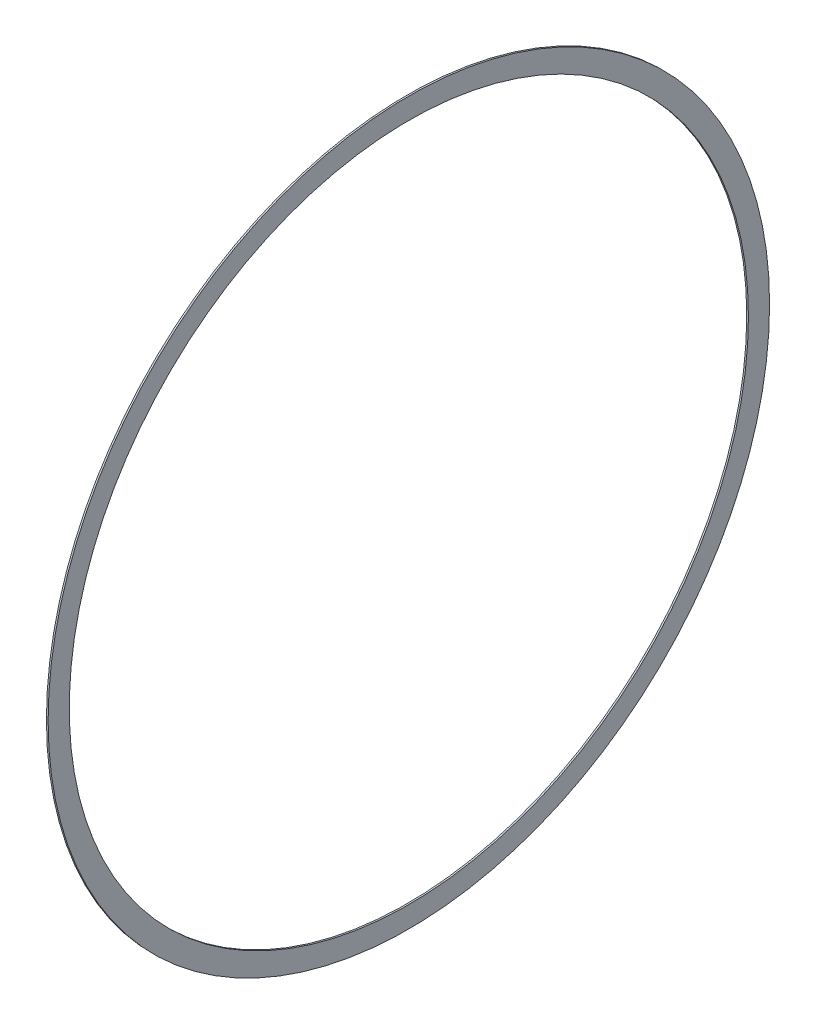
ISO-10303-21;
HEADER;
FILE_DESCRIPTION(('STEP AP214'),'2;1');
FILE_NAME('part.step','',(''),(''),'','','');
FILE_SCHEMA(('AUTOMOTIVE_DESIGN { 1 0 10303 214 1 1 1 1 }'));
ENDSEC;
DATA;
#1=APPLICATION_CONTEXT('core data for automotive mechanical design processes');
#2=APPLICATION_PROTOCOL_DEFINITION('international standard','automotive_design',2000,#1);
#3=PRODUCT_CONTEXT('',#1,'mechanical');
#4=PRODUCT('Part','Part','',(#3));
#5=PRODUCT_RELATED_PRODUCT_CATEGORY('part','',(#4));
#6=PRODUCT_DEFINITION_FORMATION('','',#4);
#7=PRODUCT_DEFINITION_CONTEXT('part definition',#1,'design');
#8=PRODUCT_DEFINITION('design','',#6,#7);
#9=PRODUCT_DEFINITION_SHAPE('','',#8);
#10=(LENGTH_UNIT() NAMED_UNIT(*) SI_UNIT(.MILLI.,.METRE.));
#11=(NAMED_UNIT(*) PLANE_ANGLE_UNIT() SI_UNIT($,.RADIAN.));
#12=(NAMED_UNIT(*) SI_UNIT($,.STERADIAN.) SOLID_ANGLE_UNIT());
#13=UNCERTAINTY_MEASURE_WITH_UNIT(LENGTH_MEASURE(1.E-05),#10,'distance_accuracy_value','');
#14=(GEOMETRIC_REPRESENTATION_CONTEXT(3) GLOBAL_UNCERTAINTY_ASSIGNED_CONTEXT((#13)) GLOBAL_UNIT_ASSIGNED_CONTEXT((#10,
#11,#12)) REPRESENTATION_CONTEXT('',''));
#15=CARTESIAN_POINT('',(0.,0.,0.));
#16=DIRECTION('',(0.,0.,1.));
#17=DIRECTION('',(1.,0.,0.));
#18=AXIS2_PLACEMENT_3D('',#15,#16,#17);
#19=CARTESIAN_POINT('',(4.,0.,0.));
#20=DIRECTION('',(1.,0.,0.));
#21=DIRECTION('',(0.,0.,-1.));
#22=AXIS2_PLACEMENT_3D('',#19,#20,#21);
#23=PLANE('',#22);
#24=CARTESIAN_POINT('',(4.,0.,0.));
#25=DIRECTION('',(1.,0.,0.));
#26=DIRECTION('',(0.,0.,-1.));
#27=AXIS2_PLACEMENT_3D('',#24,#25,#26);
#28=CIRCLE('',#27,853.);
#29=CARTESIAN_POINT('',(4.,0.,-853.));
#30=VERTEX_POINT('',#29);
#31=EDGE_CURVE('E10',#30,#30,#28,.T.);
#32=ORIENTED_EDGE('',*,*,#31,.T.);
#33=EDGE_LOOP('',(#32));
#34=FACE_BOUND('',#33,.T.);
#35=CARTESIAN_POINT('',(4.,0.,0.));
#36=DIRECTION('',(1.,0.,0.));
#37=DIRECTION('',(0.,0.,-1.));
#38=AXIS2_PLACEMENT_3D('',#35,#36,#37);
#39=CIRCLE('',#38,803.);
#40=CARTESIAN_POINT('',(4.,0.,-803.));
#41=VERTEX_POINT('',#40);
#42=EDGE_CURVE('E42',#41,#41,#39,.T.);
#43=ORIENTED_EDGE('',*,*,#42,.F.);
#44=EDGE_LOOP('',(#43));
#45=FACE_BOUND('',#44,.T.);
#46=ADVANCED_FACE('F31',(#34,#45),#23,.T.);
#47=CARTESIAN_POINT('',(0.,0.,0.));
#48=DIRECTION('',(1.,0.,0.));
#49=DIRECTION('',(0.,0.,-1.));
#50=AXIS2_PLACEMENT_3D('',#47,#48,#49);
#51=PLANE('',#50);
#52=CARTESIAN_POINT('',(0.,0.,0.));
#53=DIRECTION('',(1.,0.,0.));
#54=DIRECTION('',(0.,0.,-1.));
#55=AXIS2_PLACEMENT_3D('',#52,#53,#54);
#56=CIRCLE('',#55,853.);
#57=CARTESIAN_POINT('',(0.,0.,-853.));
#58=VERTEX_POINT('',#57);
#59=EDGE_CURVE('E35',#58,#58,#56,.T.);
#60=ORIENTED_EDGE('',*,*,#59,.F.);
#61=EDGE_LOOP('',(#60));
#62=FACE_BOUND('',#61,.T.);
#63=CARTESIAN_POINT('',(0.,0.,0.));
#64=DIRECTION('',(1.,0.,0.));
#65=DIRECTION('',(0.,0.,-1.));
#66=AXIS2_PLACEMENT_3D('',#63,#64,#65);
#67=CIRCLE('',#66,803.);
#68=CARTESIAN_POINT('',(0.,0.,-803.));
#69=VERTEX_POINT('',#68);
#70=EDGE_CURVE('E44',#69,#69,#67,.T.);
#71=ORIENTED_EDGE('',*,*,#70,.T.);
#72=EDGE_LOOP('',(#71));
#73=FACE_BOUND('',#72,.T.);
#74=ADVANCED_FACE('F54',(#62,#73),#51,.F.);
#75=CARTESIAN_POINT('',(4.,0.,0.));
#76=DIRECTION('',(-1.,0.,0.));
#77=DIRECTION('',(0.,0.,1.));
#78=AXIS2_PLACEMENT_3D('',#75,#76,#77);
#79=CYLINDRICAL_SURFACE('',#78,853.);
#80=ORIENTED_EDGE('',*,*,#31,.F.);
#81=EDGE_LOOP('',(#80));
#82=FACE_BOUND('',#81,.T.);
#83=ORIENTED_EDGE('',*,*,#59,.T.);
#84=EDGE_LOOP('',(#83));
#85=FACE_BOUND('',#84,.T.);
#86=ADVANCED_FACE('F33',(#82,#85),#79,.T.);
#87=CARTESIAN_POINT('',(4.,0.,0.));
#88=DIRECTION('',(-1.,0.,0.));
#89=DIRECTION('',(0.,0.,1.));
#90=AXIS2_PLACEMENT_3D('',#87,#88,#89);
#91=CYLINDRICAL_SURFACE('',#90,803.);
#92=ORIENTED_EDGE('',*,*,#42,.T.);
#93=EDGE_LOOP('',(#92));
#94=FACE_BOUND('',#93,.T.);
#95=ORIENTED_EDGE('',*,*,#70,.F.);
#96=EDGE_LOOP('',(#95));
#97=FACE_BOUND('',#96,.T.);
#98=ADVANCED_FACE('F50',(#94,#97),#91,.F.);
#99=CLOSED_SHELL('',(#46,#74,#86,#98));
#100=MANIFOLD_SOLID_BREP('B2',#99);
#101=ADVANCED_BREP_SHAPE_REPRESENTATION('',(#18,#100),#14);
#102=SHAPE_DEFINITION_REPRESENTATION(#9,#101);
ENDSEC;
END-ISO-10303-21;
